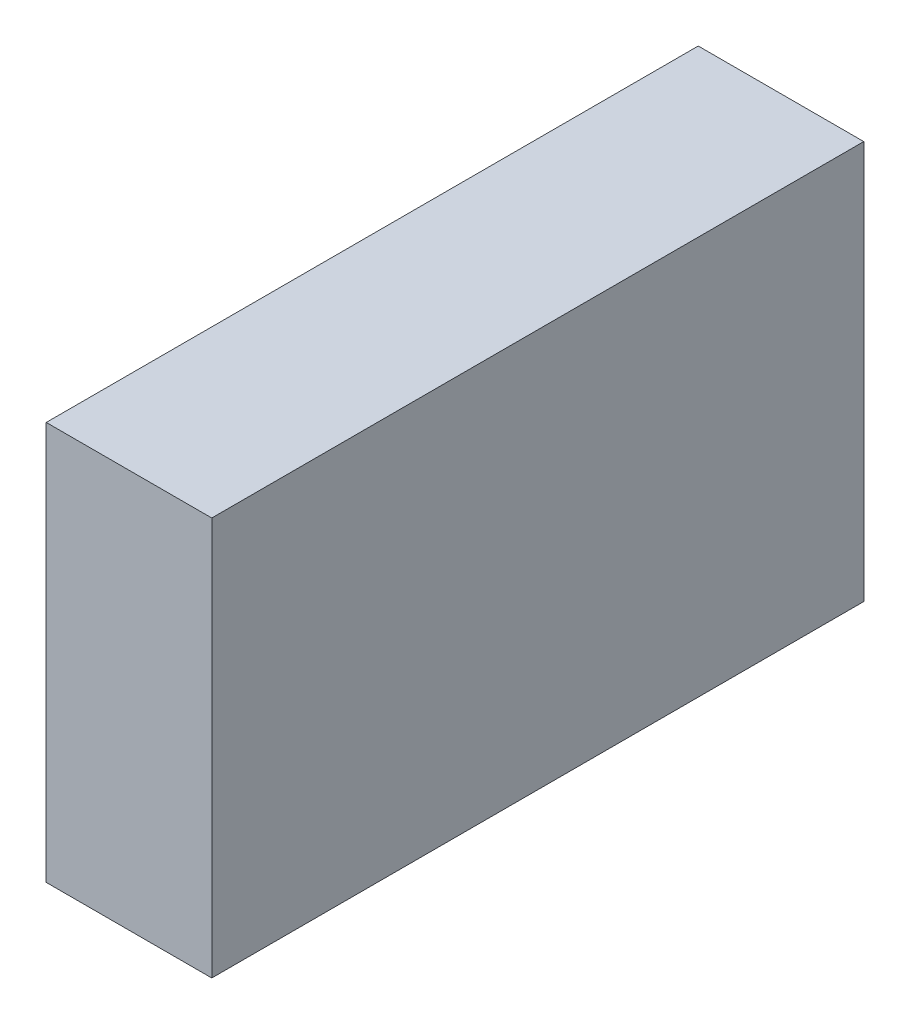
ISO-10303-21;
HEADER;
FILE_DESCRIPTION(('STEP AP214'),'2;1');
FILE_NAME('part.step','',(''),(''),'','','');
FILE_SCHEMA(('AUTOMOTIVE_DESIGN { 1 0 10303 214 1 1 1 1 }'));
ENDSEC;
DATA;
#1=APPLICATION_CONTEXT('core data for automotive mechanical design processes');
#2=APPLICATION_PROTOCOL_DEFINITION('international standard','automotive_design',2000,#1);
#3=PRODUCT_CONTEXT('',#1,'mechanical');
#4=PRODUCT('Part','Part','',(#3));
#5=PRODUCT_RELATED_PRODUCT_CATEGORY('part','',(#4));
#6=PRODUCT_DEFINITION_FORMATION('','',#4);
#7=PRODUCT_DEFINITION_CONTEXT('part definition',#1,'design');
#8=PRODUCT_DEFINITION('design','',#6,#7);
#9=PRODUCT_DEFINITION_SHAPE('','',#8);
#10=(LENGTH_UNIT() NAMED_UNIT(*) SI_UNIT(.MILLI.,.METRE.));
#11=(NAMED_UNIT(*) PLANE_ANGLE_UNIT() SI_UNIT($,.RADIAN.));
#12=(NAMED_UNIT(*) SI_UNIT($,.STERADIAN.) SOLID_ANGLE_UNIT());
#13=UNCERTAINTY_MEASURE_WITH_UNIT(LENGTH_MEASURE(1.E-05),#10,'distance_accuracy_value','');
#14=(GEOMETRIC_REPRESENTATION_CONTEXT(3) GLOBAL_UNCERTAINTY_ASSIGNED_CONTEXT((#13)) GLOBAL_UNIT_ASSIGNED_CONTEXT((#10,
#11,#12)) REPRESENTATION_CONTEXT('',''));
#15=CARTESIAN_POINT('',(0.,0.,0.));
#16=DIRECTION('',(0.,0.,1.));
#17=DIRECTION('',(1.,0.,0.));
#18=AXIS2_PLACEMENT_3D('',#15,#16,#17);
#19=CARTESIAN_POINT('',(45.56,-29.94,-98.));
#20=DIRECTION('',(0.,-1.,0.));
#21=DIRECTION('',(0.,0.,-1.));
#22=AXIS2_PLACEMENT_3D('',#19,#20,#21);
#23=PLANE('',#22);
#24=DIRECTION('',(1.,0.,0.));
#25=VECTOR('',#24,1.);
#26=CARTESIAN_POINT('',(45.56,-29.94,0.));
#27=LINE('',#26,#25);
#28=CARTESIAN_POINT('',(45.56,-29.94,0.));
#29=VERTEX_POINT('',#28);
#30=CARTESIAN_POINT('',(70.44,-29.94,0.));
#31=VERTEX_POINT('',#30);
#32=EDGE_CURVE('E103',#29,#31,#27,.T.);
#33=ORIENTED_EDGE('',*,*,#32,.F.);
#34=DIRECTION('',(0.,0.,1.));
#35=VECTOR('',#34,1.);
#36=CARTESIAN_POINT('',(45.56,-29.94,-98.));
#37=LINE('',#36,#35);
#38=CARTESIAN_POINT('',(45.56,-29.94,-98.));
#39=VERTEX_POINT('',#38);
#40=EDGE_CURVE('E11',#39,#29,#37,.T.);
#41=ORIENTED_EDGE('',*,*,#40,.F.);
#42=DIRECTION('',(1.,0.,0.));
#43=VECTOR('',#42,1.);
#44=CARTESIAN_POINT('',(45.56,-29.94,-98.));
#45=LINE('',#44,#43);
#46=CARTESIAN_POINT('',(70.44,-29.94,-98.));
#47=VERTEX_POINT('',#46);
#48=EDGE_CURVE('E97',#39,#47,#45,.T.);
#49=ORIENTED_EDGE('',*,*,#48,.T.);
#50=DIRECTION('',(0.,0.,1.));
#51=VECTOR('',#50,1.);
#52=CARTESIAN_POINT('',(70.44,-29.94,-98.));
#53=LINE('',#52,#51);
#54=EDGE_CURVE('E42',#47,#31,#53,.T.);
#55=ORIENTED_EDGE('',*,*,#54,.T.);
#56=EDGE_LOOP('',(#33,#41,#49,#55));
#57=FACE_BOUND('',#56,.T.);
#58=ADVANCED_FACE('F39',(#57),#23,.T.);
#59=CARTESIAN_POINT('',(45.56,29.94,-98.));
#60=DIRECTION('',(-1.,0.,0.));
#61=DIRECTION('',(0.,0.,1.));
#62=AXIS2_PLACEMENT_3D('',#59,#60,#61);
#63=PLANE('',#62);
#64=DIRECTION('',(0.,-1.,0.));
#65=VECTOR('',#64,1.);
#66=CARTESIAN_POINT('',(45.56,29.94,0.));
#67=LINE('',#66,#65);
#68=CARTESIAN_POINT('',(45.56,29.94,0.));
#69=VERTEX_POINT('',#68);
#70=EDGE_CURVE('E99',#69,#29,#67,.T.);
#71=ORIENTED_EDGE('',*,*,#70,.F.);
#72=DIRECTION('',(0.,0.,1.));
#73=VECTOR('',#72,1.);
#74=CARTESIAN_POINT('',(45.56,29.94,-98.));
#75=LINE('',#74,#73);
#76=CARTESIAN_POINT('',(45.56,29.94,-98.));
#77=VERTEX_POINT('',#76);
#78=EDGE_CURVE('E48',#77,#69,#75,.T.);
#79=ORIENTED_EDGE('',*,*,#78,.F.);
#80=DIRECTION('',(0.,-1.,0.));
#81=VECTOR('',#80,1.);
#82=CARTESIAN_POINT('',(45.56,29.94,-98.));
#83=LINE('',#82,#81);
#84=EDGE_CURVE('E94',#77,#39,#83,.T.);
#85=ORIENTED_EDGE('',*,*,#84,.T.);
#86=ORIENTED_EDGE('',*,*,#40,.T.);
#87=EDGE_LOOP('',(#71,#79,#85,#86));
#88=FACE_BOUND('',#87,.T.);
#89=ADVANCED_FACE('F113',(#88),#63,.T.);
#90=CARTESIAN_POINT('',(70.44,29.94,-98.));
#91=DIRECTION('',(0.,1.,0.));
#92=DIRECTION('',(0.,0.,1.));
#93=AXIS2_PLACEMENT_3D('',#90,#91,#92);
#94=PLANE('',#93);
#95=DIRECTION('',(-1.,0.,0.));
#96=VECTOR('',#95,1.);
#97=CARTESIAN_POINT('',(70.44,29.94,0.));
#98=LINE('',#97,#96);
#99=CARTESIAN_POINT('',(70.44,29.94,0.));
#100=VERTEX_POINT('',#99);
#101=EDGE_CURVE('E89',#100,#69,#98,.T.);
#102=ORIENTED_EDGE('',*,*,#101,.F.);
#103=DIRECTION('',(0.,0.,1.));
#104=VECTOR('',#103,1.);
#105=CARTESIAN_POINT('',(70.44,29.94,-98.));
#106=LINE('',#105,#104);
#107=CARTESIAN_POINT('',(70.44,29.94,-98.));
#108=VERTEX_POINT('',#107);
#109=EDGE_CURVE('E84',#108,#100,#106,.T.);
#110=ORIENTED_EDGE('',*,*,#109,.F.);
#111=DIRECTION('',(-1.,0.,0.));
#112=VECTOR('',#111,1.);
#113=CARTESIAN_POINT('',(70.44,29.94,-98.));
#114=LINE('',#113,#112);
#115=EDGE_CURVE('E87',#108,#77,#114,.T.);
#116=ORIENTED_EDGE('',*,*,#115,.T.);
#117=ORIENTED_EDGE('',*,*,#78,.T.);
#118=EDGE_LOOP('',(#102,#110,#116,#117));
#119=FACE_BOUND('',#118,.T.);
#120=ADVANCED_FACE('F86',(#119),#94,.T.);
#121=CARTESIAN_POINT('',(70.44,-29.94,-98.));
#122=DIRECTION('',(1.,0.,0.));
#123=DIRECTION('',(0.,0.,-1.));
#124=AXIS2_PLACEMENT_3D('',#121,#122,#123);
#125=PLANE('',#124);
#126=DIRECTION('',(0.,1.,0.));
#127=VECTOR('',#126,1.);
#128=CARTESIAN_POINT('',(70.44,-29.94,0.));
#129=LINE('',#128,#127);
#130=EDGE_CURVE('E106',#31,#100,#129,.T.);
#131=ORIENTED_EDGE('',*,*,#130,.F.);
#132=ORIENTED_EDGE('',*,*,#54,.F.);
#133=DIRECTION('',(0.,1.,0.));
#134=VECTOR('',#133,1.);
#135=CARTESIAN_POINT('',(70.44,-29.94,-98.));
#136=LINE('',#135,#134);
#137=EDGE_CURVE('E93',#47,#108,#136,.T.);
#138=ORIENTED_EDGE('',*,*,#137,.T.);
#139=ORIENTED_EDGE('',*,*,#109,.T.);
#140=EDGE_LOOP('',(#131,#132,#138,#139));
#141=FACE_BOUND('',#140,.T.);
#142=ADVANCED_FACE('F96',(#141),#125,.T.);
#143=CARTESIAN_POINT('',(0.,0.,-98.));
#144=DIRECTION('',(0.,0.,1.));
#145=DIRECTION('',(1.,0.,0.));
#146=AXIS2_PLACEMENT_3D('',#143,#144,#145);
#147=PLANE('',#146);
#148=ORIENTED_EDGE('',*,*,#48,.F.);
#149=ORIENTED_EDGE('',*,*,#84,.F.);
#150=ORIENTED_EDGE('',*,*,#115,.F.);
#151=ORIENTED_EDGE('',*,*,#137,.F.);
#152=EDGE_LOOP('',(#148,#149,#150,#151));
#153=FACE_BOUND('',#152,.T.);
#154=ADVANCED_FACE('F92',(#153),#147,.F.);
#155=CARTESIAN_POINT('',(0.,0.,0.));
#156=DIRECTION('',(0.,0.,1.));
#157=DIRECTION('',(1.,0.,0.));
#158=AXIS2_PLACEMENT_3D('',#155,#156,#157);
#159=PLANE('',#158);
#160=ORIENTED_EDGE('',*,*,#32,.T.);
#161=ORIENTED_EDGE('',*,*,#130,.T.);
#162=ORIENTED_EDGE('',*,*,#101,.T.);
#163=ORIENTED_EDGE('',*,*,#70,.T.);
#164=EDGE_LOOP('',(#160,#161,#162,#163));
#165=FACE_BOUND('',#164,.T.);
#166=ADVANCED_FACE('F112',(#165),#159,.T.);
#167=CLOSED_SHELL('',(#58,#89,#120,#142,#154,#166));
#168=MANIFOLD_SOLID_BREP('B2',#167);
#169=ADVANCED_BREP_SHAPE_REPRESENTATION('',(#18,#168),#14);
#170=SHAPE_DEFINITION_REPRESENTATION(#9,#169);
ENDSEC;
END-ISO-10303-21;
